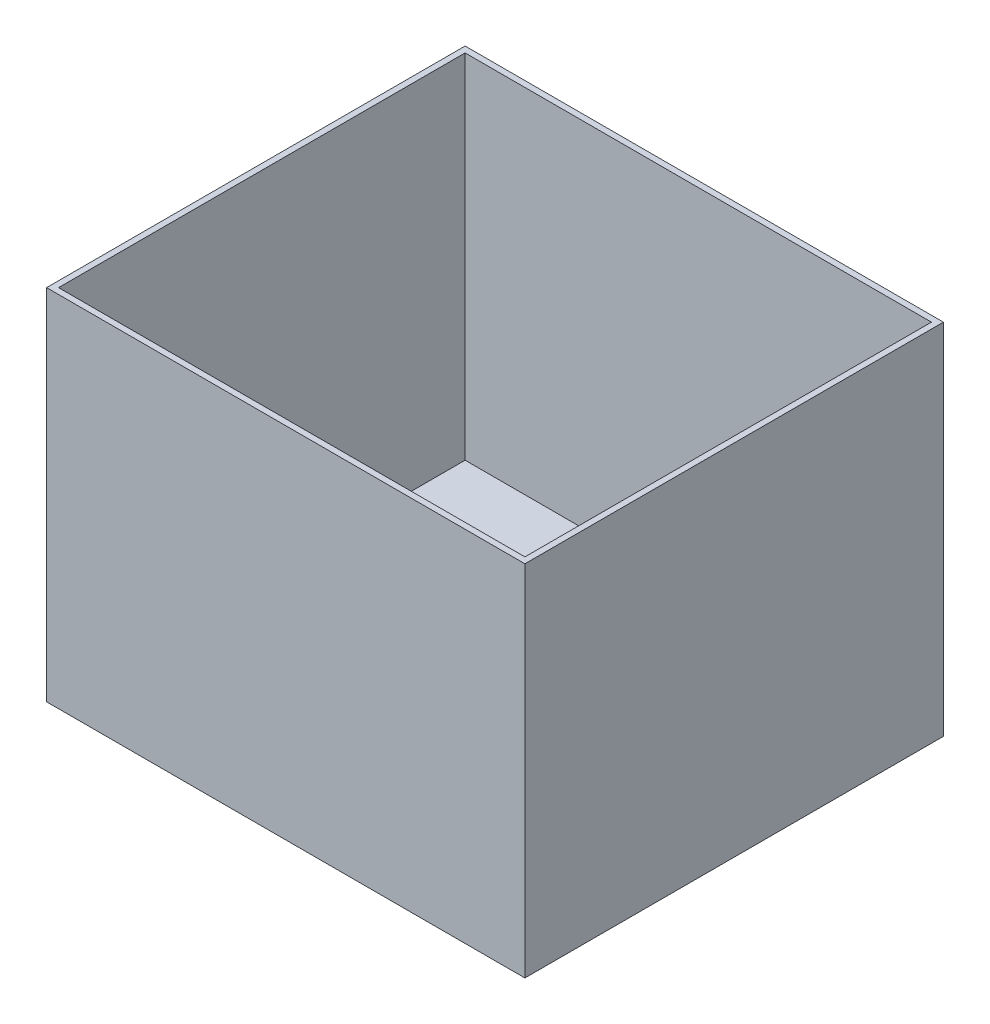
ISO-10303-21;
HEADER;
FILE_DESCRIPTION(('STEP AP214'),'2;1');
FILE_NAME('part.step','',(''),(''),'','','');
FILE_SCHEMA(('AUTOMOTIVE_DESIGN { 1 0 10303 214 1 1 1 1 }'));
ENDSEC;
DATA;
#1=APPLICATION_CONTEXT('core data for automotive mechanical design processes');
#2=APPLICATION_PROTOCOL_DEFINITION('international standard','automotive_design',2000,#1);
#3=PRODUCT_CONTEXT('',#1,'mechanical');
#4=PRODUCT('Part','Part','',(#3));
#5=PRODUCT_RELATED_PRODUCT_CATEGORY('part','',(#4));
#6=PRODUCT_DEFINITION_FORMATION('','',#4);
#7=PRODUCT_DEFINITION_CONTEXT('part definition',#1,'design');
#8=PRODUCT_DEFINITION('design','',#6,#7);
#9=PRODUCT_DEFINITION_SHAPE('','',#8);
#10=(LENGTH_UNIT() NAMED_UNIT(*) SI_UNIT(.MILLI.,.METRE.));
#11=(NAMED_UNIT(*) PLANE_ANGLE_UNIT() SI_UNIT($,.RADIAN.));
#12=(NAMED_UNIT(*) SI_UNIT($,.STERADIAN.) SOLID_ANGLE_UNIT());
#13=UNCERTAINTY_MEASURE_WITH_UNIT(LENGTH_MEASURE(1.E-05),#10,'distance_accuracy_value','');
#14=(GEOMETRIC_REPRESENTATION_CONTEXT(3) GLOBAL_UNCERTAINTY_ASSIGNED_CONTEXT((#13)) GLOBAL_UNIT_ASSIGNED_CONTEXT((#10,
#11,#12)) REPRESENTATION_CONTEXT('',''));
#15=CARTESIAN_POINT('',(0.,0.,0.));
#16=DIRECTION('',(0.,0.,1.));
#17=DIRECTION('',(1.,0.,0.));
#18=AXIS2_PLACEMENT_3D('',#15,#16,#17);
#19=CARTESIAN_POINT('',(0.,300.,0.));
#20=DIRECTION('',(0.,-1.,0.));
#21=DIRECTION('',(0.,0.,-1.));
#22=AXIS2_PLACEMENT_3D('',#19,#20,#21);
#23=PLANE('',#22);
#24=DIRECTION('',(0.,0.,1.));
#25=VECTOR('',#24,1.);
#26=CARTESIAN_POINT('',(0.,300.,0.));
#27=LINE('',#26,#25);
#28=CARTESIAN_POINT('',(0.,300.,-350.));
#29=VERTEX_POINT('',#28);
#30=CARTESIAN_POINT('',(0.,300.,0.));
#31=VERTEX_POINT('',#30);
#32=EDGE_CURVE('E157',#29,#31,#27,.T.);
#33=ORIENTED_EDGE('',*,*,#32,.T.);
#34=DIRECTION('',(1.,0.,0.));
#35=VECTOR('',#34,1.);
#36=CARTESIAN_POINT('',(0.,300.,0.));
#37=LINE('',#36,#35);
#38=CARTESIAN_POINT('',(400.,300.,0.));
#39=VERTEX_POINT('',#38);
#40=EDGE_CURVE('E92',#31,#39,#37,.T.);
#41=ORIENTED_EDGE('',*,*,#40,.T.);
#42=DIRECTION('',(0.,0.,-1.));
#43=VECTOR('',#42,1.);
#44=CARTESIAN_POINT('',(400.,300.,0.));
#45=LINE('',#44,#43);
#46=CARTESIAN_POINT('',(400.,300.,-350.));
#47=VERTEX_POINT('',#46);
#48=EDGE_CURVE('E162',#39,#47,#45,.T.);
#49=ORIENTED_EDGE('',*,*,#48,.T.);
#50=DIRECTION('',(-1.,0.,0.));
#51=VECTOR('',#50,1.);
#52=CARTESIAN_POINT('',(0.,300.,-350.));
#53=LINE('',#52,#51);
#54=EDGE_CURVE('E64',#47,#29,#53,.T.);
#55=ORIENTED_EDGE('',*,*,#54,.T.);
#56=EDGE_LOOP('',(#33,#41,#49,#55));
#57=FACE_BOUND('',#56,.T.);
#58=DIRECTION('',(0.,0.,1.));
#59=VECTOR('',#58,1.);
#60=CARTESIAN_POINT('',(5.,300.,0.));
#61=LINE('',#60,#59);
#62=CARTESIAN_POINT('',(5.,300.,-345.));
#63=VERTEX_POINT('',#62);
#64=CARTESIAN_POINT('',(5.,300.,-5.));
#65=VERTEX_POINT('',#64);
#66=EDGE_CURVE('E141',#63,#65,#61,.T.);
#67=ORIENTED_EDGE('',*,*,#66,.F.);
#68=DIRECTION('',(-1.,0.,0.));
#69=VECTOR('',#68,1.);
#70=CARTESIAN_POINT('',(0.,300.,-345.));
#71=LINE('',#70,#69);
#72=CARTESIAN_POINT('',(395.,300.,-345.));
#73=VERTEX_POINT('',#72);
#74=EDGE_CURVE('E154',#73,#63,#71,.T.);
#75=ORIENTED_EDGE('',*,*,#74,.F.);
#76=DIRECTION('',(0.,0.,-1.));
#77=VECTOR('',#76,1.);
#78=CARTESIAN_POINT('',(395.,300.,0.));
#79=LINE('',#78,#77);
#80=CARTESIAN_POINT('',(395.,300.,-5.));
#81=VERTEX_POINT('',#80);
#82=EDGE_CURVE('E151',#81,#73,#79,.T.);
#83=ORIENTED_EDGE('',*,*,#82,.F.);
#84=DIRECTION('',(1.,0.,0.));
#85=VECTOR('',#84,1.);
#86=CARTESIAN_POINT('',(0.,300.,-5.));
#87=LINE('',#86,#85);
#88=EDGE_CURVE('E130',#65,#81,#87,.T.);
#89=ORIENTED_EDGE('',*,*,#88,.F.);
#90=EDGE_LOOP('',(#67,#75,#83,#89));
#91=FACE_BOUND('',#90,.T.);
#92=ADVANCED_FACE('F39',(#57,#91),#23,.F.);
#93=CARTESIAN_POINT('',(0.,300.,0.));
#94=DIRECTION('',(1.,0.,0.));
#95=DIRECTION('',(0.,0.,-1.));
#96=AXIS2_PLACEMENT_3D('',#93,#94,#95);
#97=PLANE('',#96);
#98=DIRECTION('',(0.,0.,1.));
#99=VECTOR('',#98,1.);
#100=CARTESIAN_POINT('',(0.,0.,0.));
#101=LINE('',#100,#99);
#102=CARTESIAN_POINT('',(0.,0.,-350.));
#103=VERTEX_POINT('',#102);
#104=CARTESIAN_POINT('',(0.,0.,0.));
#105=VERTEX_POINT('',#104);
#106=EDGE_CURVE('E168',#103,#105,#101,.T.);
#107=ORIENTED_EDGE('',*,*,#106,.T.);
#108=DIRECTION('',(0.,-1.,0.));
#109=VECTOR('',#108,1.);
#110=CARTESIAN_POINT('',(0.,300.,0.));
#111=LINE('',#110,#109);
#112=EDGE_CURVE('E11',#31,#105,#111,.T.);
#113=ORIENTED_EDGE('',*,*,#112,.F.);
#114=ORIENTED_EDGE('',*,*,#32,.F.);
#115=DIRECTION('',(0.,-1.,0.));
#116=VECTOR('',#115,1.);
#117=CARTESIAN_POINT('',(0.,300.,-350.));
#118=LINE('',#117,#116);
#119=EDGE_CURVE('E167',#29,#103,#118,.T.);
#120=ORIENTED_EDGE('',*,*,#119,.T.);
#121=EDGE_LOOP('',(#107,#113,#114,#120));
#122=FACE_BOUND('',#121,.T.);
#123=ADVANCED_FACE('F41',(#122),#97,.F.);
#124=CARTESIAN_POINT('',(0.,300.,0.));
#125=DIRECTION('',(0.,0.,-1.));
#126=DIRECTION('',(-1.,0.,0.));
#127=AXIS2_PLACEMENT_3D('',#124,#125,#126);
#128=PLANE('',#127);
#129=DIRECTION('',(1.,0.,0.));
#130=VECTOR('',#129,1.);
#131=CARTESIAN_POINT('',(0.,0.,0.));
#132=LINE('',#131,#130);
#133=CARTESIAN_POINT('',(400.,0.,0.));
#134=VERTEX_POINT('',#133);
#135=EDGE_CURVE('E172',#105,#134,#132,.T.);
#136=ORIENTED_EDGE('',*,*,#135,.T.);
#137=DIRECTION('',(0.,-1.,0.));
#138=VECTOR('',#137,1.);
#139=CARTESIAN_POINT('',(400.,300.,0.));
#140=LINE('',#139,#138);
#141=EDGE_CURVE('E48',#39,#134,#140,.T.);
#142=ORIENTED_EDGE('',*,*,#141,.F.);
#143=ORIENTED_EDGE('',*,*,#40,.F.);
#144=ORIENTED_EDGE('',*,*,#112,.T.);
#145=EDGE_LOOP('',(#136,#142,#143,#144));
#146=FACE_BOUND('',#145,.T.);
#147=ADVANCED_FACE('F206',(#146),#128,.F.);
#148=CARTESIAN_POINT('',(400.,300.,0.));
#149=DIRECTION('',(-1.,0.,0.));
#150=DIRECTION('',(0.,0.,1.));
#151=AXIS2_PLACEMENT_3D('',#148,#149,#150);
#152=PLANE('',#151);
#153=DIRECTION('',(0.,0.,-1.));
#154=VECTOR('',#153,1.);
#155=CARTESIAN_POINT('',(400.,0.,0.));
#156=LINE('',#155,#154);
#157=CARTESIAN_POINT('',(400.,0.,-350.));
#158=VERTEX_POINT('',#157);
#159=EDGE_CURVE('E175',#134,#158,#156,.T.);
#160=ORIENTED_EDGE('',*,*,#159,.T.);
#161=DIRECTION('',(0.,-1.,0.));
#162=VECTOR('',#161,1.);
#163=CARTESIAN_POINT('',(400.,300.,-350.));
#164=LINE('',#163,#162);
#165=EDGE_CURVE('E182',#47,#158,#164,.T.);
#166=ORIENTED_EDGE('',*,*,#165,.F.);
#167=ORIENTED_EDGE('',*,*,#48,.F.);
#168=ORIENTED_EDGE('',*,*,#141,.T.);
#169=EDGE_LOOP('',(#160,#166,#167,#168));
#170=FACE_BOUND('',#169,.T.);
#171=ADVANCED_FACE('F189',(#170),#152,.F.);
#172=CARTESIAN_POINT('',(0.,300.,-350.));
#173=DIRECTION('',(0.,0.,1.));
#174=DIRECTION('',(1.,0.,0.));
#175=AXIS2_PLACEMENT_3D('',#172,#173,#174);
#176=PLANE('',#175);
#177=DIRECTION('',(-1.,0.,0.));
#178=VECTOR('',#177,1.);
#179=CARTESIAN_POINT('',(0.,0.,-350.));
#180=LINE('',#179,#178);
#181=EDGE_CURVE('E85',#158,#103,#180,.T.);
#182=ORIENTED_EDGE('',*,*,#181,.T.);
#183=ORIENTED_EDGE('',*,*,#119,.F.);
#184=ORIENTED_EDGE('',*,*,#54,.F.);
#185=ORIENTED_EDGE('',*,*,#165,.T.);
#186=EDGE_LOOP('',(#182,#183,#184,#185));
#187=FACE_BOUND('',#186,.T.);
#188=ADVANCED_FACE('F197',(#187),#176,.F.);
#189=CARTESIAN_POINT('',(0.,0.,0.));
#190=DIRECTION('',(0.,-1.,0.));
#191=DIRECTION('',(0.,0.,-1.));
#192=AXIS2_PLACEMENT_3D('',#189,#190,#191);
#193=PLANE('',#192);
#194=ORIENTED_EDGE('',*,*,#106,.F.);
#195=ORIENTED_EDGE('',*,*,#181,.F.);
#196=ORIENTED_EDGE('',*,*,#159,.F.);
#197=ORIENTED_EDGE('',*,*,#135,.F.);
#198=EDGE_LOOP('',(#194,#195,#196,#197));
#199=FACE_BOUND('',#198,.T.);
#200=ADVANCED_FACE('F193',(#199),#193,.T.);
#201=CARTESIAN_POINT('',(5.,300.,0.));
#202=DIRECTION('',(1.,0.,0.));
#203=DIRECTION('',(0.,0.,-1.));
#204=AXIS2_PLACEMENT_3D('',#201,#202,#203);
#205=PLANE('',#204);
#206=DIRECTION('',(0.,0.,1.));
#207=VECTOR('',#206,1.);
#208=CARTESIAN_POINT('',(5.,5.,0.));
#209=LINE('',#208,#207);
#210=CARTESIAN_POINT('',(5.,5.,-345.));
#211=VERTEX_POINT('',#210);
#212=CARTESIAN_POINT('',(5.,5.,-5.));
#213=VERTEX_POINT('',#212);
#214=EDGE_CURVE('E120',#211,#213,#209,.T.);
#215=ORIENTED_EDGE('',*,*,#214,.F.);
#216=DIRECTION('',(0.,-1.,0.));
#217=VECTOR('',#216,1.);
#218=CARTESIAN_POINT('',(5.,300.,-345.));
#219=LINE('',#218,#217);
#220=EDGE_CURVE('E145',#63,#211,#219,.T.);
#221=ORIENTED_EDGE('',*,*,#220,.F.);
#222=ORIENTED_EDGE('',*,*,#66,.T.);
#223=DIRECTION('',(0.,-1.,0.));
#224=VECTOR('',#223,1.);
#225=CARTESIAN_POINT('',(5.,300.,-5.));
#226=LINE('',#225,#224);
#227=EDGE_CURVE('E134',#65,#213,#226,.T.);
#228=ORIENTED_EDGE('',*,*,#227,.T.);
#229=EDGE_LOOP('',(#215,#221,#222,#228));
#230=FACE_BOUND('',#229,.T.);
#231=ADVANCED_FACE('F204',(#230),#205,.T.);
#232=CARTESIAN_POINT('',(0.,300.,-5.));
#233=DIRECTION('',(0.,0.,-1.));
#234=DIRECTION('',(-1.,0.,0.));
#235=AXIS2_PLACEMENT_3D('',#232,#233,#234);
#236=PLANE('',#235);
#237=DIRECTION('',(1.,0.,0.));
#238=VECTOR('',#237,1.);
#239=CARTESIAN_POINT('',(0.,5.,-5.));
#240=LINE('',#239,#238);
#241=CARTESIAN_POINT('',(395.,5.,-5.));
#242=VERTEX_POINT('',#241);
#243=EDGE_CURVE('E114',#213,#242,#240,.T.);
#244=ORIENTED_EDGE('',*,*,#243,.F.);
#245=ORIENTED_EDGE('',*,*,#227,.F.);
#246=ORIENTED_EDGE('',*,*,#88,.T.);
#247=DIRECTION('',(0.,-1.,0.));
#248=VECTOR('',#247,1.);
#249=CARTESIAN_POINT('',(395.,300.,-5.));
#250=LINE('',#249,#248);
#251=EDGE_CURVE('E127',#81,#242,#250,.T.);
#252=ORIENTED_EDGE('',*,*,#251,.T.);
#253=EDGE_LOOP('',(#244,#245,#246,#252));
#254=FACE_BOUND('',#253,.T.);
#255=ADVANCED_FACE('F128',(#254),#236,.T.);
#256=CARTESIAN_POINT('',(395.,300.,0.));
#257=DIRECTION('',(-1.,0.,0.));
#258=DIRECTION('',(0.,0.,1.));
#259=AXIS2_PLACEMENT_3D('',#256,#257,#258);
#260=PLANE('',#259);
#261=DIRECTION('',(0.,0.,-1.));
#262=VECTOR('',#261,1.);
#263=CARTESIAN_POINT('',(395.,5.,0.));
#264=LINE('',#263,#262);
#265=CARTESIAN_POINT('',(395.,5.,-345.));
#266=VERTEX_POINT('',#265);
#267=EDGE_CURVE('E118',#242,#266,#264,.T.);
#268=ORIENTED_EDGE('',*,*,#267,.F.);
#269=ORIENTED_EDGE('',*,*,#251,.F.);
#270=ORIENTED_EDGE('',*,*,#82,.T.);
#271=DIRECTION('',(0.,-1.,0.));
#272=VECTOR('',#271,1.);
#273=CARTESIAN_POINT('',(395.,300.,-345.));
#274=LINE('',#273,#272);
#275=EDGE_CURVE('E55',#73,#266,#274,.T.);
#276=ORIENTED_EDGE('',*,*,#275,.T.);
#277=EDGE_LOOP('',(#268,#269,#270,#276));
#278=FACE_BOUND('',#277,.T.);
#279=ADVANCED_FACE('F136',(#278),#260,.T.);
#280=CARTESIAN_POINT('',(0.,300.,-345.));
#281=DIRECTION('',(0.,0.,1.));
#282=DIRECTION('',(1.,0.,0.));
#283=AXIS2_PLACEMENT_3D('',#280,#281,#282);
#284=PLANE('',#283);
#285=DIRECTION('',(-1.,0.,0.));
#286=VECTOR('',#285,1.);
#287=CARTESIAN_POINT('',(0.,5.,-345.));
#288=LINE('',#287,#286);
#289=EDGE_CURVE('E138',#266,#211,#288,.T.);
#290=ORIENTED_EDGE('',*,*,#289,.F.);
#291=ORIENTED_EDGE('',*,*,#275,.F.);
#292=ORIENTED_EDGE('',*,*,#74,.T.);
#293=ORIENTED_EDGE('',*,*,#220,.T.);
#294=EDGE_LOOP('',(#290,#291,#292,#293));
#295=FACE_BOUND('',#294,.T.);
#296=ADVANCED_FACE('F217',(#295),#284,.T.);
#297=CARTESIAN_POINT('',(0.,5.,0.));
#298=DIRECTION('',(0.,-1.,0.));
#299=DIRECTION('',(0.,0.,-1.));
#300=AXIS2_PLACEMENT_3D('',#297,#298,#299);
#301=PLANE('',#300);
#302=ORIENTED_EDGE('',*,*,#214,.T.);
#303=ORIENTED_EDGE('',*,*,#243,.T.);
#304=ORIENTED_EDGE('',*,*,#267,.T.);
#305=ORIENTED_EDGE('',*,*,#289,.T.);
#306=EDGE_LOOP('',(#302,#303,#304,#305));
#307=FACE_BOUND('',#306,.T.);
#308=ADVANCED_FACE('F116',(#307),#301,.F.);
#309=CLOSED_SHELL('',(#92,#123,#147,#171,#188,#200,#231,#255,#279,#296,#308));
#310=MANIFOLD_SOLID_BREP('B2',#309);
#311=ADVANCED_BREP_SHAPE_REPRESENTATION('',(#18,#310),#14);
#312=SHAPE_DEFINITION_REPRESENTATION(#9,#311);
ENDSEC;
END-ISO-10303-21;
